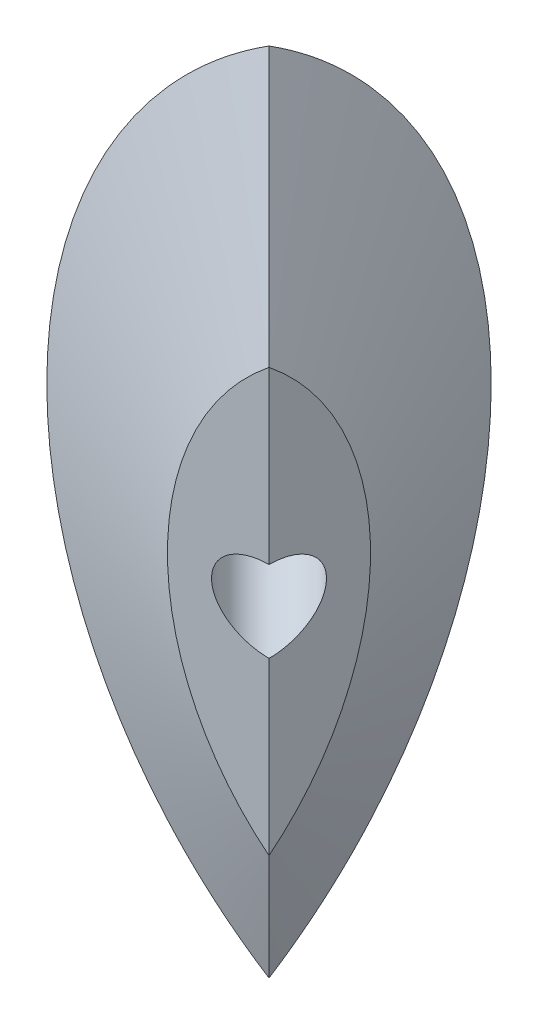
ISO-10303-21;
HEADER;
FILE_DESCRIPTION(('STEP AP214'),'2;1');
FILE_NAME('part.step','',(''),(''),'','','');
FILE_SCHEMA(('AUTOMOTIVE_DESIGN { 1 0 10303 214 1 1 1 1 }'));
ENDSEC;
DATA;
#1=APPLICATION_CONTEXT('core data for automotive mechanical design processes');
#2=APPLICATION_PROTOCOL_DEFINITION('international standard','automotive_design',2000,#1);
#3=PRODUCT_CONTEXT('',#1,'mechanical');
#4=PRODUCT('Part','Part','',(#3));
#5=PRODUCT_RELATED_PRODUCT_CATEGORY('part','',(#4));
#6=PRODUCT_DEFINITION_FORMATION('','',#4);
#7=PRODUCT_DEFINITION_CONTEXT('part definition',#1,'design');
#8=PRODUCT_DEFINITION('design','',#6,#7);
#9=PRODUCT_DEFINITION_SHAPE('','',#8);
#10=(LENGTH_UNIT() NAMED_UNIT(*) SI_UNIT(.MILLI.,.METRE.));
#11=(NAMED_UNIT(*) PLANE_ANGLE_UNIT() SI_UNIT($,.RADIAN.));
#12=(NAMED_UNIT(*) SI_UNIT($,.STERADIAN.) SOLID_ANGLE_UNIT());
#13=UNCERTAINTY_MEASURE_WITH_UNIT(LENGTH_MEASURE(1.E-05),#10,'distance_accuracy_value','');
#14=(GEOMETRIC_REPRESENTATION_CONTEXT(3) GLOBAL_UNCERTAINTY_ASSIGNED_CONTEXT((#13)) GLOBAL_UNIT_ASSIGNED_CONTEXT((#10,
#11,#12)) REPRESENTATION_CONTEXT('',''));
#15=CARTESIAN_POINT('',(0.,0.,0.));
#16=DIRECTION('',(0.,0.,1.));
#17=DIRECTION('',(1.,0.,0.));
#18=AXIS2_PLACEMENT_3D('',#15,#16,#17);
#19=CARTESIAN_POINT('',(0.,0.,0.));
#20=DIRECTION('',(0.,1.,0.));
#21=DIRECTION('',(0.,0.,-1.));
#22=AXIS2_PLACEMENT_3D('',#19,#20,#21);
#23=SPHERICAL_SURFACE('',#22,40.);
#24=CARTESIAN_POINT('',(-28.1436219546992,0.,-28.143621954699));
#25=DIRECTION('',(0.707106781186549,0.,0.707106781186545));
#26=DIRECTION('',(0.707106781186545,0.,-0.70710678118655));
#27=AXIS2_PLACEMENT_3D('',#24,#25,#26);
#28=CIRCLE('',#27,3.98410423331954);
#29=CARTESIAN_POINT('',(-30.9608090750334,0.,-25.3264348343648));
#30=VERTEX_POINT('',#29);
#31=EDGE_CURVE('E11',#30,#30,#28,.T.);
#32=ORIENTED_EDGE('',*,*,#31,.T.);
#33=EDGE_LOOP('',(#32));
#34=FACE_BOUND('',#33,.T.);
#35=CARTESIAN_POINT('',(-18.8636263841509,0.,0.));
#36=DIRECTION('',(1.,0.,0.));
#37=DIRECTION('',(0.,0.,-1.));
#38=AXIS2_PLACEMENT_3D('',#35,#36,#37);
#39=CIRCLE('',#38,35.2727033219622);
#40=CARTESIAN_POINT('',(-18.8636263841509,-29.8048183902927,-18.8636263841509));
#41=VERTEX_POINT('',#40);
#42=CARTESIAN_POINT('',(-18.8636263841509,29.8048183902927,-18.8636263841509));
#43=VERTEX_POINT('',#42);
#44=EDGE_CURVE('E83',#41,#43,#39,.T.);
#45=ORIENTED_EDGE('',*,*,#44,.F.);
#46=CARTESIAN_POINT('',(0.,0.,-18.8636263841509));
#47=DIRECTION('',(0.,0.,1.));
#48=DIRECTION('',(1.,0.,0.));
#49=AXIS2_PLACEMENT_3D('',#46,#47,#48);
#50=CIRCLE('',#49,35.2727033219622);
#51=EDGE_CURVE('E128',#41,#43,#50,.F.);
#52=ORIENTED_EDGE('',*,*,#51,.T.);
#53=EDGE_LOOP('',(#45,#52));
#54=FACE_BOUND('',#53,.T.);
#55=ADVANCED_FACE('F33',(#34,#54),#23,.T.);
#56=CARTESIAN_POINT('',(-25.,0.,0.));
#57=DIRECTION('',(-1.,0.,0.));
#58=DIRECTION('',(0.,0.,1.));
#59=AXIS2_PLACEMENT_3D('',#56,#57,#58);
#60=CONICAL_SURFACE('',#59,50.,1.17600520709514);
#61=CARTESIAN_POINT('',(-12.4998,15.6120402315136,-12.4998));
#62=CARTESIAN_POINT('',(-12.7613427863279,16.206660357072,-12.7613427863279));
#63=CARTESIAN_POINT('',(-13.0236858747113,16.8005741644141,-13.0236858747113));
#64=CARTESIAN_POINT('',(-13.5496377819248,17.9872773444552,-13.5496377819248));
#65=CARTESIAN_POINT('',(-13.8132465964491,18.5800667209699,-13.8132465964491));
#66=CARTESIAN_POINT('',(-14.3413943726193,19.764807688998,-14.3413943726193));
#67=CARTESIAN_POINT('',(-14.6059333254626,20.3567592883659,-14.6059333254626));
#68=CARTESIAN_POINT('',(-15.1357415699195,21.5400091290945,-15.1357415699195));
#69=CARTESIAN_POINT('',(-15.4010108622486,22.1313073698145,-15.4010108622486));
#70=CARTESIAN_POINT('',(-16.1976668932599,23.9044265239106,-16.1976668932599));
#71=CARTESIAN_POINT('',(-16.7299060412714,25.085481397413,-16.7299060412714));
#72=CARTESIAN_POINT('',(-17.52937716037,26.8560661874584,-17.52937716037));
#73=CARTESIAN_POINT('',(-17.7960542426176,27.4460977533855,-17.7960542426176));
#74=CARTESIAN_POINT('',(-18.3297205576464,28.625877943893,-18.3297205576464));
#75=CARTESIAN_POINT('',(-18.5967097902183,29.2156265686627,-18.5967097902183));
#76=CARTESIAN_POINT('',(-18.8638263841509,29.8052598682408,-18.8638263841509));
#77=B_SPLINE_CURVE_WITH_KNOTS('',3,(#61,#62,#63,#64,#65,#66,#67,#68,#69,#70,#71,#72,#73,#74,#75,
#76),.UNSPECIFIED.,.F.,.F.,(4,2,2,2,2,2,2,4),(0.,2.10081510172673,4.20162306175755,
6.30241119368677,8.40320138428005,12.6047479570983,14.7055418354452,16.806334306406),.UNSPECIFIED.);
#78=CARTESIAN_POINT('',(-12.5,15.612494995996,-12.5));
#79=VERTEX_POINT('',#78);
#80=EDGE_CURVE('E55',#79,#43,#77,.T.);
#81=ORIENTED_EDGE('',*,*,#80,.F.);
#82=CARTESIAN_POINT('',(-12.5,0.,0.));
#83=DIRECTION('',(-1.,0.,0.));
#84=DIRECTION('',(0.,0.,1.));
#85=AXIS2_PLACEMENT_3D('',#82,#83,#84);
#86=CIRCLE('',#85,20.);
#87=CARTESIAN_POINT('',(-12.5,-15.612494995996,-12.5));
#88=VERTEX_POINT('',#87);
#89=EDGE_CURVE('E82',#79,#88,#86,.T.);
#90=ORIENTED_EDGE('',*,*,#89,.T.);
#91=CARTESIAN_POINT('',(-18.8638263841509,-29.8052598682408,-18.8638263841509));
#92=CARTESIAN_POINT('',(-18.5967097902183,-29.2156265686627,-18.5967097902183));
#93=CARTESIAN_POINT('',(-18.3297205576464,-28.625877943893,-18.3297205576464));
#94=CARTESIAN_POINT('',(-17.7960542426176,-27.4460977533855,-17.7960542426176));
#95=CARTESIAN_POINT('',(-17.52937716037,-26.8560661874584,-17.52937716037));
#96=CARTESIAN_POINT('',(-16.7299060412714,-25.085481397413,-16.7299060412714));
#97=CARTESIAN_POINT('',(-16.1976668932599,-23.9044265239106,-16.1976668932599));
#98=CARTESIAN_POINT('',(-15.4010108622486,-22.1313073698145,-15.4010108622486));
#99=CARTESIAN_POINT('',(-15.1357415699195,-21.5400091290945,-15.1357415699195));
#100=CARTESIAN_POINT('',(-14.6059333254626,-20.3567592883659,-14.6059333254626));
#101=CARTESIAN_POINT('',(-14.3413943726193,-19.764807688998,-14.3413943726193));
#102=CARTESIAN_POINT('',(-13.8132465964491,-18.5800667209699,-13.8132465964491));
#103=CARTESIAN_POINT('',(-13.5496377819248,-17.9872773444552,-13.5496377819248));
#104=CARTESIAN_POINT('',(-13.0236858747113,-16.8005741644141,-13.0236858747113));
#105=CARTESIAN_POINT('',(-12.7613427863279,-16.206660357072,-12.7613427863279));
#106=CARTESIAN_POINT('',(-12.4998,-15.6120402315136,-12.4998));
#107=B_SPLINE_CURVE_WITH_KNOTS('',3,(#91,#92,#93,#94,#95,#96,#97,#98,#99,#100,#101,#102,#103,
#104,#105,#106),.UNSPECIFIED.,.F.,.F.,(4,2,2,2,2,2,2,4),(0.,2.1007924709608,4.20158634930772,
8.40313292212594,10.5039231127192,12.6047112446484,14.7055192046793,16.806334306406),.UNSPECIFIED.);
#108=EDGE_CURVE('E121',#41,#88,#107,.T.);
#109=ORIENTED_EDGE('',*,*,#108,.F.);
#110=ORIENTED_EDGE('',*,*,#44,.T.);
#111=EDGE_LOOP('',(#81,#90,#109,#110));
#112=FACE_BOUND('',#111,.T.);
#113=ADVANCED_FACE('F100',(#112),#60,.T.);
#114=CARTESIAN_POINT('',(0.,0.,-12.5));
#115=DIRECTION('',(0.,0.,-1.));
#116=DIRECTION('',(-1.,0.,0.));
#117=AXIS2_PLACEMENT_3D('',#114,#115,#116);
#118=CONICAL_SURFACE('',#117,20.,1.17600520709514);
#119=ORIENTED_EDGE('',*,*,#80,.T.);
#120=ORIENTED_EDGE('',*,*,#51,.F.);
#121=ORIENTED_EDGE('',*,*,#108,.T.);
#122=CARTESIAN_POINT('',(0.,0.,-12.5));
#123=DIRECTION('',(0.,0.,-1.));
#124=DIRECTION('',(-1.,0.,0.));
#125=AXIS2_PLACEMENT_3D('',#122,#123,#124);
#126=CIRCLE('',#125,20.);
#127=EDGE_CURVE('E79',#88,#79,#126,.T.);
#128=ORIENTED_EDGE('',*,*,#127,.T.);
#129=EDGE_LOOP('',(#119,#120,#121,#128));
#130=FACE_BOUND('',#129,.T.);
#131=ADVANCED_FACE('F105',(#130),#118,.T.);
#132=CARTESIAN_POINT('',(-20.,-29.8048183902927,-12.5));
#133=DIRECTION('',(0.,0.,-1.));
#134=DIRECTION('',(-1.,0.,0.));
#135=AXIS2_PLACEMENT_3D('',#132,#133,#134);
#136=PLANE('',#135);
#137=CARTESIAN_POINT('',(-12.5,0.,-12.5));
#138=DIRECTION('',(0.,0.,-1.));
#139=DIRECTION('',(1.,0.,0.));
#140=AXIS2_PLACEMENT_3D('',#137,#138,#139);
#141=ELLIPSE('',#140,4.2426406871193,3.);
#142=CARTESIAN_POINT('',(-12.5,3.,-12.5));
#143=VERTEX_POINT('',#142);
#144=CARTESIAN_POINT('',(-12.5,-3.,-12.5));
#145=VERTEX_POINT('',#144);
#146=EDGE_CURVE('E47',#143,#145,#141,.F.);
#147=ORIENTED_EDGE('',*,*,#146,.F.);
#148=DIRECTION('',(0.,1.,0.));
#149=VECTOR('',#148,1.);
#150=CARTESIAN_POINT('',(-12.5,-29.8048183902927,-12.5));
#151=LINE('',#150,#149);
#152=EDGE_CURVE('E77',#143,#79,#151,.T.);
#153=ORIENTED_EDGE('',*,*,#152,.T.);
#154=ORIENTED_EDGE('',*,*,#127,.F.);
#155=EDGE_CURVE('E72',#88,#145,#151,.T.);
#156=ORIENTED_EDGE('',*,*,#155,.T.);
#157=EDGE_LOOP('',(#147,#153,#154,#156));
#158=FACE_BOUND('',#157,.T.);
#159=ADVANCED_FACE('F75',(#158),#136,.F.);
#160=CARTESIAN_POINT('',(-12.5,-29.8048183902927,-12.5));
#161=DIRECTION('',(-1.,0.,0.));
#162=DIRECTION('',(0.,0.,1.));
#163=AXIS2_PLACEMENT_3D('',#160,#161,#162);
#164=PLANE('',#163);
#165=CARTESIAN_POINT('',(-12.5,0.,-12.5));
#166=DIRECTION('',(-1.,0.,0.));
#167=DIRECTION('',(0.,0.,1.));
#168=AXIS2_PLACEMENT_3D('',#165,#166,#167);
#169=ELLIPSE('',#168,4.24264068711928,3.);
#170=EDGE_CURVE('E66',#145,#143,#169,.F.);
#171=ORIENTED_EDGE('',*,*,#170,.F.);
#172=ORIENTED_EDGE('',*,*,#155,.F.);
#173=ORIENTED_EDGE('',*,*,#89,.F.);
#174=ORIENTED_EDGE('',*,*,#152,.F.);
#175=EDGE_LOOP('',(#171,#172,#173,#174));
#176=FACE_BOUND('',#175,.T.);
#177=ADVANCED_FACE('F81',(#176),#164,.F.);
#178=CARTESIAN_POINT('',(0.,0.,0.));
#179=DIRECTION('',(0.707106781186549,0.,0.707106781186546));
#180=DIRECTION('',(0.707106781186546,0.,-0.707106781186549));
#181=AXIS2_PLACEMENT_3D('',#178,#179,#180);
#182=CYLINDRICAL_SURFACE('',#181,3.);
#183=CARTESIAN_POINT('',(-27.5451079288573,0.,-27.5451079288572));
#184=DIRECTION('',(0.707106781186549,0.,0.707106781186545));
#185=DIRECTION('',(0.707106781186545,0.,-0.70710678118655));
#186=AXIS2_PLACEMENT_3D('',#183,#184,#185);
#187=CIRCLE('',#186,3.);
#188=CARTESIAN_POINT('',(-29.6664282724169,0.,-25.4237875852975));
#189=VERTEX_POINT('',#188);
#190=EDGE_CURVE('E41',#189,#189,#187,.F.);
#191=ORIENTED_EDGE('',*,*,#190,.T.);
#192=EDGE_LOOP('',(#191));
#193=FACE_BOUND('',#192,.T.);
#194=ORIENTED_EDGE('',*,*,#146,.T.);
#195=ORIENTED_EDGE('',*,*,#170,.T.);
#196=EDGE_LOOP('',(#194,#195));
#197=FACE_BOUND('',#196,.T.);
#198=ADVANCED_FACE('F67',(#193,#197),#182,.F.);
#199=CARTESIAN_POINT('',(-27.5451079288573,0.,-27.5451079288572));
#200=DIRECTION('',(-0.707106781186549,0.,-0.707106781186545));
#201=DIRECTION('',(-0.707106781186545,0.,0.70710678118655));
#202=AXIS2_PLACEMENT_3D('',#199,#200,#201);
#203=CONICAL_SURFACE('',#202,3.,0.860468654474163);
#204=CARTESIAN_POINT('',(-30.9608090750334,0.,-25.3264348343648));
#205=CARTESIAN_POINT('',(-30.9473259416729,0.,-25.3274489255203));
#206=CARTESIAN_POINT('',(-30.9338428083123,0.,-25.3284630166759));
#207=CARTESIAN_POINT('',(-30.9068765415911,0.,-25.330491198987));
#208=CARTESIAN_POINT('',(-30.8933934082305,0.,-25.3315052901425));
#209=CARTESIAN_POINT('',(-30.8664271415093,0.,-25.3335334724536));
#210=CARTESIAN_POINT('',(-30.8529440081487,0.,-25.3345475636092));
#211=CARTESIAN_POINT('',(-30.8259777414276,0.,-25.3365757459203));
#212=CARTESIAN_POINT('',(-30.812494608067,0.,-25.3375898370758));
#213=CARTESIAN_POINT('',(-30.7855283413458,0.,-25.3396180193869));
#214=CARTESIAN_POINT('',(-30.7720452079852,0.,-25.3406321105425));
#215=CARTESIAN_POINT('',(-30.745078941264,0.,-25.3426602928536));
#216=CARTESIAN_POINT('',(-30.7315958079034,0.,-25.3436743840091));
#217=CARTESIAN_POINT('',(-30.7046295411822,0.,-25.3457025663202));
#218=CARTESIAN_POINT('',(-30.6911464078217,0.,-25.3467166574758));
#219=CARTESIAN_POINT('',(-30.6641801411005,0.,-25.3487448397869));
#220=CARTESIAN_POINT('',(-30.6506970077399,0.,-25.3497589309424));
#221=CARTESIAN_POINT('',(-30.6237307410187,0.,-25.3517871132535));
#222=CARTESIAN_POINT('',(-30.6102476076581,0.,-25.3528012044091));
#223=CARTESIAN_POINT('',(-30.5832813409369,0.,-25.3548293867202));
#224=CARTESIAN_POINT('',(-30.5697982075764,0.,-25.3558434778757));
#225=CARTESIAN_POINT('',(-30.5428319408552,0.,-25.3578716601868));
#226=CARTESIAN_POINT('',(-30.5293488074946,0.,-25.3588857513424));
#227=CARTESIAN_POINT('',(-30.5023825407734,0.,-25.3609139336535));
#228=CARTESIAN_POINT('',(-30.4888994074128,0.,-25.361928024809));
#229=CARTESIAN_POINT('',(-30.4619331406916,0.,-25.3639562071201));
#230=CARTESIAN_POINT('',(-30.4484500073311,0.,-25.3649702982757));
#231=CARTESIAN_POINT('',(-30.4214837406099,0.,-25.3669984805868));
#232=CARTESIAN_POINT('',(-30.4080006072493,0.,-25.3680125717423));
#233=CARTESIAN_POINT('',(-30.3810343405281,0.,-25.3700407540534));
#234=CARTESIAN_POINT('',(-30.3675512071675,0.,-25.371054845209));
#235=CARTESIAN_POINT('',(-30.3405849404463,0.,-25.3730830275201));
#236=CARTESIAN_POINT('',(-30.3271018070858,0.,-25.3740971186756));
#237=CARTESIAN_POINT('',(-30.3001355403646,0.,-25.3761253009867));
#238=CARTESIAN_POINT('',(-30.286652407004,0.,-25.3771393921423));
#239=CARTESIAN_POINT('',(-30.2596861402828,0.,-25.3791675744533));
#240=CARTESIAN_POINT('',(-30.2462030069222,0.,-25.3801816656089));
#241=CARTESIAN_POINT('',(-30.219236740201,0.,-25.38220984792));
#242=CARTESIAN_POINT('',(-30.2057536068405,0.,-25.3832239390755));
#243=CARTESIAN_POINT('',(-30.1787873401193,0.,-25.3852521213866));
#244=CARTESIAN_POINT('',(-30.1653042067587,0.,-25.3862662125422));
#245=CARTESIAN_POINT('',(-30.1383379400375,0.,-25.3882943948533));
#246=CARTESIAN_POINT('',(-30.1248548066769,0.,-25.3893084860088));
#247=CARTESIAN_POINT('',(-30.0978885399557,0.,-25.3913366683199));
#248=CARTESIAN_POINT('',(-30.0844054065952,0.,-25.3923507594755));
#249=CARTESIAN_POINT('',(-30.057439139874,0.,-25.3943789417866));
#250=CARTESIAN_POINT('',(-30.0439560065134,0.,-25.3953930329421));
#251=CARTESIAN_POINT('',(-30.0169897397922,0.,-25.3974212152532));
#252=CARTESIAN_POINT('',(-30.0035066064316,0.,-25.3984353064088));
#253=CARTESIAN_POINT('',(-29.9765403397104,0.,-25.4004634887199));
#254=CARTESIAN_POINT('',(-29.9630572063499,0.,-25.4014775798754));
#255=CARTESIAN_POINT('',(-29.9360909396287,0.,-25.4035057621865));
#256=CARTESIAN_POINT('',(-29.9226078062681,0.,-25.4045198533421));
#257=CARTESIAN_POINT('',(-29.8956415395469,0.,-25.4065480356532));
#258=CARTESIAN_POINT('',(-29.8821584061863,0.,-25.4075621268087));
#259=CARTESIAN_POINT('',(-29.8551921394651,0.,-25.4095903091198));
#260=CARTESIAN_POINT('',(-29.8417090061046,0.,-25.4106044002754));
#261=CARTESIAN_POINT('',(-29.8147427393834,0.,-25.4126325825865));
#262=CARTESIAN_POINT('',(-29.8012596060228,0.,-25.413646673742));
#263=CARTESIAN_POINT('',(-29.7742933393016,0.,-25.4156748560531));
#264=CARTESIAN_POINT('',(-29.760810205941,0.,-25.4166889472087));
#265=CARTESIAN_POINT('',(-29.7338439392198,0.,-25.4187171295198));
#266=CARTESIAN_POINT('',(-29.7203608058593,0.,-25.4197312206753));
#267=CARTESIAN_POINT('',(-29.6933945391381,0.,-25.4217594029864));
#268=CARTESIAN_POINT('',(-29.6799114057775,0.,-25.422773494142));
#269=CARTESIAN_POINT('',(-29.6664282724169,0.,-25.4237875852975));
#270=B_SPLINE_CURVE_WITH_KNOTS('',3,(#204,#205,#206,#207,#208,#209,#210,#211,#212,#213,#214,
#215,#216,#217,#218,#219,#220,#221,#222,#223,#224,#225,#226,#227,#228,#229,#230,#231,#232,#233,
#234,#235,#236,#237,#238,#239,#240,#241,#242,#243,#244,#245,#246,#247,#248,#249,#250,#251,#252,
#253,#254,#255,#256,#257,#258,#259,#260,#261,#262,#263,#264,#265,#266,#267,#268,#269),
.UNSPECIFIED.,.F.,.F.,(4,2,2,2,2,2,2,2,2,2,2,2,2,2,2,2,2,2,2,2,2,2,2,2,2,2,2,2,2,2,2,2,4),(0.,
0.0405636462219653,0.081127292443931,0.121690938665897,0.162254584887859,0.202818231109824,
0.24338187733179,0.283945523553755,0.324509169775717,0.365072815997686,0.405636462219648,
0.44620010844161,0.486763754663579,0.527327400885542,0.567891047107507,0.608454693329473,
0.649018339551438,0.6895819857734,0.730145631995366,0.770709278217332,0.811272924439293,
0.851836570661263,0.892400216883225,0.93296386310519,0.973527509327156,1.01409115554912,
1.05465480177108,1.09521844799305,1.13578209421501,1.17634574043698,1.21690938665895,
1.25747303288091,1.29803667910287),.UNSPECIFIED.);
#271=EDGE_CURVE('BSEAM35',#30,#189,#270,.T.);
#272=ORIENTED_EDGE('',*,*,#31,.F.);
#273=ORIENTED_EDGE('',*,*,#190,.F.);
#274=ORIENTED_EDGE('',*,*,#271,.T.);
#275=ORIENTED_EDGE('',*,*,#271,.F.);
#276=EDGE_LOOP('',(#272,#274,#273,#275));
#277=FACE_BOUND('',#276,.T.);
#278=ADVANCED_FACE('F35',(#277),#203,.F.);
#279=CLOSED_SHELL('',(#55,#113,#131,#159,#177,#198,#278));
#280=MANIFOLD_SOLID_BREP('B2',#279);
#281=ADVANCED_BREP_SHAPE_REPRESENTATION('',(#18,#280),#14);
#282=SHAPE_DEFINITION_REPRESENTATION(#9,#281);
ENDSEC;
END-ISO-10303-21;
